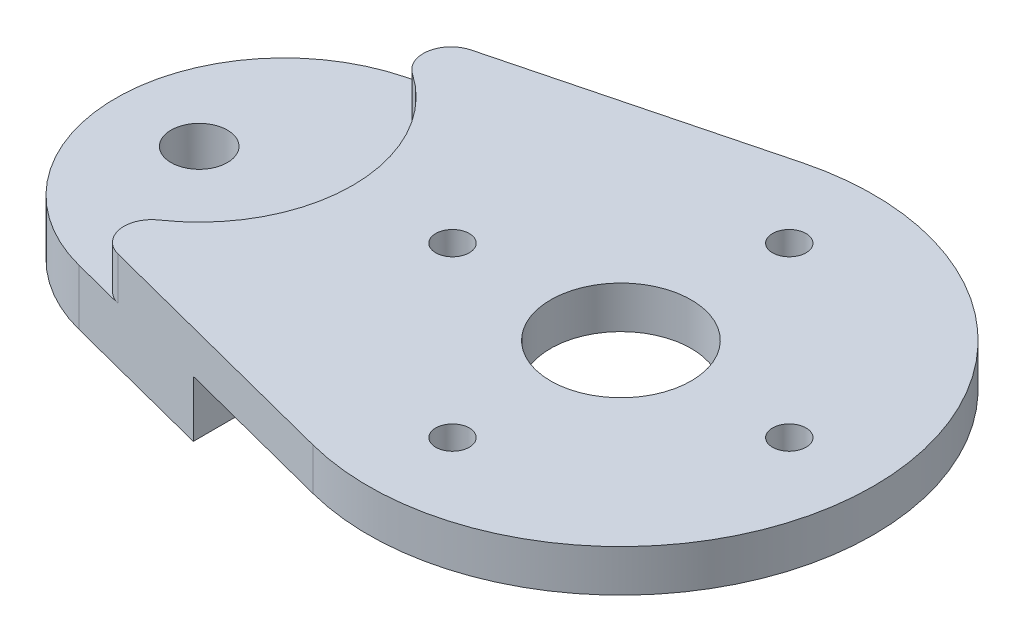
ISO-10303-21;
HEADER;
FILE_DESCRIPTION(('STEP AP214'),'2;1');
FILE_NAME('part.step','',(''),(''),'','','');
FILE_SCHEMA(('AUTOMOTIVE_DESIGN { 1 0 10303 214 1 1 1 1 }'));
ENDSEC;
DATA;
#1=APPLICATION_CONTEXT('core data for automotive mechanical design processes');
#2=APPLICATION_PROTOCOL_DEFINITION('international standard','automotive_design',2000,#1);
#3=PRODUCT_CONTEXT('',#1,'mechanical');
#4=PRODUCT('Part','Part','',(#3));
#5=PRODUCT_RELATED_PRODUCT_CATEGORY('part','',(#4));
#6=PRODUCT_DEFINITION_FORMATION('','',#4);
#7=PRODUCT_DEFINITION_CONTEXT('part definition',#1,'design');
#8=PRODUCT_DEFINITION('design','',#6,#7);
#9=PRODUCT_DEFINITION_SHAPE('','',#8);
#10=(LENGTH_UNIT() NAMED_UNIT(*) SI_UNIT(.MILLI.,.METRE.));
#11=(NAMED_UNIT(*) PLANE_ANGLE_UNIT() SI_UNIT($,.RADIAN.));
#12=(NAMED_UNIT(*) SI_UNIT($,.STERADIAN.) SOLID_ANGLE_UNIT());
#13=UNCERTAINTY_MEASURE_WITH_UNIT(LENGTH_MEASURE(1.E-05),#10,'distance_accuracy_value','');
#14=(GEOMETRIC_REPRESENTATION_CONTEXT(3) GLOBAL_UNCERTAINTY_ASSIGNED_CONTEXT((#13)) GLOBAL_UNIT_ASSIGNED_CONTEXT((#10,
#11,#12)) REPRESENTATION_CONTEXT('',''));
#15=CARTESIAN_POINT('',(0.,0.,0.));
#16=DIRECTION('',(0.,0.,1.));
#17=DIRECTION('',(1.,0.,0.));
#18=AXIS2_PLACEMENT_3D('',#15,#16,#17);
#19=CARTESIAN_POINT('',(0.,0.,0.));
#20=DIRECTION('',(0.,1.,0.));
#21=DIRECTION('',(0.,0.,1.));
#22=AXIS2_PLACEMENT_3D('',#19,#20,#21);
#23=PLANE('',#22);
#24=CARTESIAN_POINT('',(-30.226,0.,0.));
#25=DIRECTION('',(0.,1.,0.));
#26=DIRECTION('',(0.,0.,1.));
#27=AXIS2_PLACEMENT_3D('',#24,#25,#26);
#28=CIRCLE('',#27,10.033);
#29=CARTESIAN_POINT('',(-30.226,0.,10.033));
#30=VERTEX_POINT('',#29);
#31=EDGE_CURVE('E334',#30,#30,#28,.T.);
#32=ORIENTED_EDGE('',*,*,#31,.T.);
#33=EDGE_LOOP('',(#32));
#34=FACE_BOUND('',#33,.T.);
#35=DIRECTION('',(0.,0.,-1.));
#36=VECTOR('',#35,1.);
#37=CARTESIAN_POINT('',(39.878,0.,-116.327463550728));
#38=LINE('',#37,#36);
#39=CARTESIAN_POINT('',(39.878,0.,72.2063523133526));
#40=VERTEX_POINT('',#39);
#41=CARTESIAN_POINT('',(39.878,0.,-72.2063523133527));
#42=VERTEX_POINT('',#41);
#43=EDGE_CURVE('E118',#40,#42,#38,.T.);
#44=ORIENTED_EDGE('',*,*,#43,.F.);
#45=DIRECTION('',(0.968245836551854,0.,0.25));
#46=VECTOR('',#45,1.);
#47=CARTESIAN_POINT('',(-14.986,0.,58.0405284262644));
#48=LINE('',#47,#46);
#49=CARTESIAN_POINT('',(-14.986,0.,58.0405284262644));
#50=VERTEX_POINT('',#49);
#51=EDGE_CURVE('E131',#50,#40,#48,.T.);
#52=ORIENTED_EDGE('',*,*,#51,.F.);
#53=CARTESIAN_POINT('',(0.,0.,0.));
#54=DIRECTION('',(0.,1.,0.));
#55=DIRECTION('',(0.,0.,1.));
#56=AXIS2_PLACEMENT_3D('',#53,#54,#55);
#57=CIRCLE('',#56,59.944);
#58=CARTESIAN_POINT('',(-14.986,0.,-58.0405284262644));
#59=VERTEX_POINT('',#58);
#60=EDGE_CURVE('E136',#59,#50,#57,.T.);
#61=ORIENTED_EDGE('',*,*,#60,.F.);
#62=DIRECTION('',(-0.968245836551854,0.,0.25));
#63=VECTOR('',#62,1.);
#64=CARTESIAN_POINT('',(-14.986,0.,-58.0405284262644));
#65=LINE('',#64,#63);
#66=EDGE_CURVE('E132',#42,#59,#65,.T.);
#67=ORIENTED_EDGE('',*,*,#66,.F.);
#68=EDGE_LOOP('',(#44,#52,#61,#67));
#69=FACE_BOUND('',#68,.T.);
#70=ADVANCED_FACE('F39',(#34,#69),#23,.F.);
#71=CARTESIAN_POINT('',(0.,35.052,0.));
#72=DIRECTION('',(0.,-1.,0.));
#73=DIRECTION('',(0.,0.,-1.));
#74=AXIS2_PLACEMENT_3D('',#71,#72,#73);
#75=CYLINDRICAL_SURFACE('',#74,59.944);
#76=DIRECTION('',(0.,-1.,0.));
#77=VECTOR('',#76,1.);
#78=CARTESIAN_POINT('',(-14.986,35.052,58.0405284262644));
#79=LINE('',#78,#77);
#80=CARTESIAN_POINT('',(-14.986,19.812,58.0405284262644));
#81=VERTEX_POINT('',#80);
#82=EDGE_CURVE('E140',#81,#50,#79,.T.);
#83=ORIENTED_EDGE('',*,*,#82,.F.);
#84=CARTESIAN_POINT('',(0.,19.812,0.));
#85=DIRECTION('',(0.,1.,0.));
#86=DIRECTION('',(0.,0.,1.));
#87=AXIS2_PLACEMENT_3D('',#84,#85,#86);
#88=CIRCLE('',#87,59.944);
#89=CARTESIAN_POINT('',(-14.986,19.812,-58.0405284262644));
#90=VERTEX_POINT('',#89);
#91=EDGE_CURVE('E62',#90,#81,#88,.T.);
#92=ORIENTED_EDGE('',*,*,#91,.F.);
#93=DIRECTION('',(0.,-1.,0.));
#94=VECTOR('',#93,1.);
#95=CARTESIAN_POINT('',(-14.986,35.052,-58.0405284262644));
#96=LINE('',#95,#94);
#97=EDGE_CURVE('E148',#90,#59,#96,.T.);
#98=ORIENTED_EDGE('',*,*,#97,.T.);
#99=ORIENTED_EDGE('',*,*,#60,.T.);
#100=EDGE_LOOP('',(#83,#92,#98,#99));
#101=FACE_BOUND('',#100,.T.);
#102=ADVANCED_FACE('F181',(#101),#75,.T.);
#103=CARTESIAN_POINT('',(-14.986,35.052,58.0405284262644));
#104=DIRECTION('',(0.25,0.,-0.968245836551854));
#105=DIRECTION('',(-0.968245836551854,0.,-0.25));
#106=AXIS2_PLACEMENT_3D('',#103,#104,#105);
#107=PLANE('',#106);
#108=ORIENTED_EDGE('',*,*,#51,.T.);
#109=DIRECTION('',(0.,1.,0.));
#110=VECTOR('',#109,1.);
#111=CARTESIAN_POINT('',(39.878,35.052,72.2063523133527));
#112=LINE('',#111,#110);
#113=CARTESIAN_POINT('',(39.878,20.066,72.2063523133526));
#114=VERTEX_POINT('',#113);
#115=EDGE_CURVE('E116',#40,#114,#112,.T.);
#116=ORIENTED_EDGE('',*,*,#115,.T.);
#117=DIRECTION('',(0.968245836551854,0.,0.25));
#118=VECTOR('',#117,1.);
#119=CARTESIAN_POINT('',(-14.986,20.066,58.0405284262644));
#120=LINE('',#119,#118);
#121=CARTESIAN_POINT('',(97.4089999999999,20.066,87.0607926393966));
#122=VERTEX_POINT('',#121);
#123=EDGE_CURVE('E318',#114,#122,#120,.T.);
#124=ORIENTED_EDGE('',*,*,#123,.T.);
#125=DIRECTION('',(0.,-1.,0.));
#126=VECTOR('',#125,1.);
#127=CARTESIAN_POINT('',(97.4089999999999,35.052,87.0607926393966));
#128=LINE('',#127,#126);
#129=CARTESIAN_POINT('',(97.4089999999999,35.052,87.0607926393966));
#130=VERTEX_POINT('',#129);
#131=EDGE_CURVE('E155',#130,#122,#128,.T.);
#132=ORIENTED_EDGE('',*,*,#131,.F.);
#133=DIRECTION('',(0.968245836551854,0.,0.25));
#134=VECTOR('',#133,1.);
#135=CARTESIAN_POINT('',(-14.986,35.052,58.0405284262644));
#136=LINE('',#135,#134);
#137=CARTESIAN_POINT('',(3.69078405660418,35.052,62.8628533337271));
#138=VERTEX_POINT('',#137);
#139=EDGE_CURVE('E137',#138,#130,#136,.T.);
#140=ORIENTED_EDGE('',*,*,#139,.F.);
#141=DIRECTION('',(0.,1.,0.));
#142=VECTOR('',#141,1.);
#143=CARTESIAN_POINT('',(3.69078405660418,35.052,62.8628533337271));
#144=LINE('',#143,#142);
#145=CARTESIAN_POINT('',(3.69078405660418,19.812,62.8628533337271));
#146=VERTEX_POINT('',#145);
#147=EDGE_CURVE('E215',#138,#146,#144,.F.);
#148=ORIENTED_EDGE('',*,*,#147,.T.);
#149=DIRECTION('',(-0.968245836551854,0.,-0.25));
#150=VECTOR('',#149,1.);
#151=CARTESIAN_POINT('',(-14.986,19.812,58.0405284262644));
#152=LINE('',#151,#150);
#153=EDGE_CURVE('E230',#146,#81,#152,.T.);
#154=ORIENTED_EDGE('',*,*,#153,.T.);
#155=ORIENTED_EDGE('',*,*,#82,.T.);
#156=EDGE_LOOP('',(#108,#116,#124,#132,#140,#148,#154,#155));
#157=FACE_BOUND('',#156,.T.);
#158=ADVANCED_FACE('F134',(#157),#107,.F.);
#159=CARTESIAN_POINT('',(119.888,35.052,0.));
#160=DIRECTION('',(0.,-1.,0.));
#161=DIRECTION('',(0.,0.,-1.));
#162=AXIS2_PLACEMENT_3D('',#159,#160,#161);
#163=CYLINDRICAL_SURFACE('',#162,89.9160000000001);
#164=ORIENTED_EDGE('',*,*,#131,.T.);
#165=CARTESIAN_POINT('',(119.888,20.066,0.));
#166=DIRECTION('',(0.,1.,0.));
#167=DIRECTION('',(0.,0.,1.));
#168=AXIS2_PLACEMENT_3D('',#165,#166,#167);
#169=CIRCLE('',#168,89.9160000000001);
#170=CARTESIAN_POINT('',(97.409,20.066,-87.0607926393966));
#171=VERTEX_POINT('',#170);
#172=EDGE_CURVE('E313',#122,#171,#169,.T.);
#173=ORIENTED_EDGE('',*,*,#172,.T.);
#174=DIRECTION('',(0.,-1.,0.));
#175=VECTOR('',#174,1.);
#176=CARTESIAN_POINT('',(97.409,35.052,-87.0607926393966));
#177=LINE('',#176,#175);
#178=CARTESIAN_POINT('',(97.409,35.052,-87.0607926393966));
#179=VERTEX_POINT('',#178);
#180=EDGE_CURVE('E146',#179,#171,#177,.T.);
#181=ORIENTED_EDGE('',*,*,#180,.F.);
#182=CARTESIAN_POINT('',(119.888,35.052,0.));
#183=DIRECTION('',(0.,1.,0.));
#184=DIRECTION('',(0.,0.,1.));
#185=AXIS2_PLACEMENT_3D('',#182,#183,#184);
#186=CIRCLE('',#185,89.9160000000001);
#187=EDGE_CURVE('E246',#130,#179,#186,.T.);
#188=ORIENTED_EDGE('',*,*,#187,.F.);
#189=EDGE_LOOP('',(#164,#173,#181,#188));
#190=FACE_BOUND('',#189,.T.);
#191=ADVANCED_FACE('F190',(#190),#163,.T.);
#192=CARTESIAN_POINT('',(-14.986,35.052,-58.0405284262644));
#193=DIRECTION('',(0.25,0.,0.968245836551854));
#194=DIRECTION('',(0.968245836551854,0.,-0.25));
#195=AXIS2_PLACEMENT_3D('',#192,#193,#194);
#196=PLANE('',#195);
#197=DIRECTION('',(-0.968245836551854,0.,0.25));
#198=VECTOR('',#197,1.);
#199=CARTESIAN_POINT('',(-14.986,20.066,-58.0405284262644));
#200=LINE('',#199,#198);
#201=CARTESIAN_POINT('',(39.878,20.066,-72.2063523133526));
#202=VERTEX_POINT('',#201);
#203=EDGE_CURVE('E310',#171,#202,#200,.T.);
#204=ORIENTED_EDGE('',*,*,#203,.T.);
#205=DIRECTION('',(0.,-1.,0.));
#206=VECTOR('',#205,1.);
#207=CARTESIAN_POINT('',(39.878,35.052,-72.2063523133527));
#208=LINE('',#207,#206);
#209=EDGE_CURVE('E122',#202,#42,#208,.T.);
#210=ORIENTED_EDGE('',*,*,#209,.T.);
#211=ORIENTED_EDGE('',*,*,#66,.T.);
#212=ORIENTED_EDGE('',*,*,#97,.F.);
#213=DIRECTION('',(0.968245836551854,0.,-0.25));
#214=VECTOR('',#213,1.);
#215=CARTESIAN_POINT('',(-14.986,19.812,-58.0405284262644));
#216=LINE('',#215,#214);
#217=CARTESIAN_POINT('',(3.69078405660417,19.812,-62.8628533337271));
#218=VERTEX_POINT('',#217);
#219=EDGE_CURVE('E222',#90,#218,#216,.T.);
#220=ORIENTED_EDGE('',*,*,#219,.T.);
#221=DIRECTION('',(0.,1.,0.));
#222=VECTOR('',#221,1.);
#223=CARTESIAN_POINT('',(3.69078405660416,35.052,-62.8628533337271));
#224=LINE('',#223,#222);
#225=CARTESIAN_POINT('',(3.69078405660416,35.052,-62.8628533337271));
#226=VERTEX_POINT('',#225);
#227=EDGE_CURVE('E217',#218,#226,#224,.T.);
#228=ORIENTED_EDGE('',*,*,#227,.T.);
#229=DIRECTION('',(-0.968245836551854,0.,0.25));
#230=VECTOR('',#229,1.);
#231=CARTESIAN_POINT('',(-14.986,35.052,-58.0405284262644));
#232=LINE('',#231,#230);
#233=EDGE_CURVE('E149',#179,#226,#232,.T.);
#234=ORIENTED_EDGE('',*,*,#233,.F.);
#235=ORIENTED_EDGE('',*,*,#180,.T.);
#236=EDGE_LOOP('',(#204,#210,#211,#212,#220,#228,#234,#235));
#237=FACE_BOUND('',#236,.T.);
#238=ADVANCED_FACE('F176',(#237),#196,.F.);
#239=CARTESIAN_POINT('',(0.,35.052,0.));
#240=DIRECTION('',(0.,1.,0.));
#241=DIRECTION('',(0.,0.,1.));
#242=AXIS2_PLACEMENT_3D('',#239,#240,#241);
#243=PLANE('',#242);
#244=CARTESIAN_POINT('',(119.888,35.052,59.944));
#245=DIRECTION('',(0.,1.,0.));
#246=DIRECTION('',(-1.,0.,0.));
#247=AXIS2_PLACEMENT_3D('',#244,#245,#246);
#248=CIRCLE('',#247,5.96900000000001);
#249=CARTESIAN_POINT('',(113.919,35.052,59.944));
#250=VERTEX_POINT('',#249);
#251=EDGE_CURVE('E321',#250,#250,#248,.T.);
#252=ORIENTED_EDGE('',*,*,#251,.F.);
#253=EDGE_LOOP('',(#252));
#254=FACE_BOUND('',#253,.T.);
#255=CARTESIAN_POINT('',(59.944,35.052,0.));
#256=DIRECTION('',(0.,1.,0.));
#257=DIRECTION('',(0.,0.,-1.));
#258=AXIS2_PLACEMENT_3D('',#255,#256,#257);
#259=CIRCLE('',#258,5.96900000000001);
#260=CARTESIAN_POINT('',(59.944,35.052,-5.96900000000001));
#261=VERTEX_POINT('',#260);
#262=EDGE_CURVE('E324',#261,#261,#259,.T.);
#263=ORIENTED_EDGE('',*,*,#262,.F.);
#264=EDGE_LOOP('',(#263));
#265=FACE_BOUND('',#264,.T.);
#266=CARTESIAN_POINT('',(119.888000000001,35.052,-59.944));
#267=DIRECTION('',(0.,1.,0.));
#268=DIRECTION('',(1.,0.,0.));
#269=AXIS2_PLACEMENT_3D('',#266,#267,#268);
#270=CIRCLE('',#269,5.96900000000001);
#271=CARTESIAN_POINT('',(125.857000000001,35.052,-59.9439999999999));
#272=VERTEX_POINT('',#271);
#273=EDGE_CURVE('E124',#272,#272,#270,.T.);
#274=ORIENTED_EDGE('',*,*,#273,.F.);
#275=EDGE_LOOP('',(#274));
#276=FACE_BOUND('',#275,.T.);
#277=CARTESIAN_POINT('',(179.832,35.052,0.));
#278=DIRECTION('',(0.,1.,0.));
#279=DIRECTION('',(0.,0.,1.));
#280=AXIS2_PLACEMENT_3D('',#277,#278,#279);
#281=CIRCLE('',#280,5.96900000000001);
#282=CARTESIAN_POINT('',(179.832,35.052,5.96900000000001));
#283=VERTEX_POINT('',#282);
#284=EDGE_CURVE('E322',#283,#283,#281,.T.);
#285=ORIENTED_EDGE('',*,*,#284,.F.);
#286=EDGE_LOOP('',(#285));
#287=FACE_BOUND('',#286,.T.);
#288=CARTESIAN_POINT('',(-30.226,35.052,0.));
#289=DIRECTION('',(0.,1.,0.));
#290=DIRECTION('',(0.,0.,-1.));
#291=AXIS2_PLACEMENT_3D('',#288,#289,#290);
#292=CIRCLE('',#291,54.61);
#293=CARTESIAN_POINT('',(0.579338866810639,35.052,45.0919416004785));
#294=VERTEX_POINT('',#293);
#295=CARTESIAN_POINT('',(0.579338866810619,35.052,-45.0919416004785));
#296=VERTEX_POINT('',#295);
#297=EDGE_CURVE('E240',#294,#296,#292,.T.);
#298=ORIENTED_EDGE('',*,*,#297,.F.);
#299=CARTESIAN_POINT('',(6.16728405660419,35.052,53.2714100768444));
#300=DIRECTION('',(0.,1.,0.));
#301=DIRECTION('',(0.,0.,1.));
#302=AXIS2_PLACEMENT_3D('',#299,#300,#301);
#303=CIRCLE('',#302,9.906);
#304=EDGE_CURVE('E228',#294,#138,#303,.T.);
#305=ORIENTED_EDGE('',*,*,#304,.T.);
#306=ORIENTED_EDGE('',*,*,#139,.T.);
#307=ORIENTED_EDGE('',*,*,#187,.T.);
#308=ORIENTED_EDGE('',*,*,#233,.T.);
#309=CARTESIAN_POINT('',(6.16728405660417,35.052,-53.2714100768444));
#310=DIRECTION('',(0.,1.,0.));
#311=DIRECTION('',(0.,0.,1.));
#312=AXIS2_PLACEMENT_3D('',#309,#310,#311);
#313=CIRCLE('',#312,9.906);
#314=EDGE_CURVE('E233',#226,#296,#313,.T.);
#315=ORIENTED_EDGE('',*,*,#314,.T.);
#316=EDGE_LOOP('',(#298,#305,#306,#307,#308,#315));
#317=FACE_BOUND('',#316,.T.);
#318=CARTESIAN_POINT('',(119.888,35.052012,0.));
#319=DIRECTION('',(0.,1.,0.));
#320=DIRECTION('',(0.,0.,1.));
#321=AXIS2_PLACEMENT_3D('',#318,#319,#320);
#322=CIRCLE('',#321,25.019);
#323=CARTESIAN_POINT('',(119.888,35.052012,25.019));
#324=VERTEX_POINT('',#323);
#325=EDGE_CURVE('E142',#324,#324,#322,.T.);
#326=ORIENTED_EDGE('',*,*,#325,.F.);
#327=EDGE_LOOP('',(#326));
#328=FACE_BOUND('',#327,.T.);
#329=ADVANCED_FACE('F170',(#254,#265,#276,#287,#317,#328),#243,.T.);
#330=CARTESIAN_POINT('',(-30.226,0.,0.));
#331=DIRECTION('',(0.,1.,0.));
#332=DIRECTION('',(0.,0.,1.));
#333=AXIS2_PLACEMENT_3D('',#330,#331,#332);
#334=CYLINDRICAL_SURFACE('',#333,10.033);
#335=CARTESIAN_POINT('',(-30.226,19.812,0.));
#336=DIRECTION('',(0.,-1.,0.));
#337=DIRECTION('',(0.,0.,-1.));
#338=AXIS2_PLACEMENT_3D('',#335,#336,#337);
#339=CIRCLE('',#338,10.033);
#340=CARTESIAN_POINT('',(-30.226,19.812,-10.033));
#341=VERTEX_POINT('',#340);
#342=EDGE_CURVE('E164',#341,#341,#339,.F.);
#343=ORIENTED_EDGE('',*,*,#342,.T.);
#344=EDGE_LOOP('',(#343));
#345=FACE_BOUND('',#344,.T.);
#346=ORIENTED_EDGE('',*,*,#31,.F.);
#347=EDGE_LOOP('',(#346));
#348=FACE_BOUND('',#347,.T.);
#349=ADVANCED_FACE('F180',(#345,#348),#334,.F.);
#350=CARTESIAN_POINT('',(119.888,0.,0.));
#351=DIRECTION('',(0.,1.,0.));
#352=DIRECTION('',(0.,0.,1.));
#353=AXIS2_PLACEMENT_3D('',#350,#351,#352);
#354=CYLINDRICAL_SURFACE('',#353,25.019);
#355=CARTESIAN_POINT('',(119.888,20.066,0.));
#356=DIRECTION('',(0.,1.,0.));
#357=DIRECTION('',(0.,0.,1.));
#358=AXIS2_PLACEMENT_3D('',#355,#356,#357);
#359=CIRCLE('',#358,25.019);
#360=CARTESIAN_POINT('',(119.888,20.066,25.019));
#361=VERTEX_POINT('',#360);
#362=EDGE_CURVE('E306',#361,#361,#359,.F.);
#363=ORIENTED_EDGE('',*,*,#362,.T.);
#364=EDGE_LOOP('',(#363));
#365=FACE_BOUND('',#364,.T.);
#366=ORIENTED_EDGE('',*,*,#325,.T.);
#367=EDGE_LOOP('',(#366));
#368=FACE_BOUND('',#367,.T.);
#369=ADVANCED_FACE('F260',(#365,#368),#354,.F.);
#370=CARTESIAN_POINT('',(-15.113,19.812,0.));
#371=DIRECTION('',(0.,-1.,0.));
#372=DIRECTION('',(0.,0.,-1.));
#373=AXIS2_PLACEMENT_3D('',#370,#371,#372);
#374=PLANE('',#373);
#375=ORIENTED_EDGE('',*,*,#91,.T.);
#376=ORIENTED_EDGE('',*,*,#153,.F.);
#377=CARTESIAN_POINT('',(6.16728405660419,19.812,53.2714100768444));
#378=DIRECTION('',(0.,-1.,0.));
#379=DIRECTION('',(0.,0.,-1.));
#380=AXIS2_PLACEMENT_3D('',#377,#378,#379);
#381=CIRCLE('',#380,9.906);
#382=CARTESIAN_POINT('',(0.579338866810639,19.812,45.0919416004785));
#383=VERTEX_POINT('',#382);
#384=EDGE_CURVE('E48',#146,#383,#381,.T.);
#385=ORIENTED_EDGE('',*,*,#384,.T.);
#386=CARTESIAN_POINT('',(-30.226,19.812,0.));
#387=DIRECTION('',(0.,1.,0.));
#388=DIRECTION('',(0.,0.,-1.));
#389=AXIS2_PLACEMENT_3D('',#386,#387,#388);
#390=CIRCLE('',#389,54.61);
#391=CARTESIAN_POINT('',(0.579338866810619,19.812,-45.0919416004785));
#392=VERTEX_POINT('',#391);
#393=EDGE_CURVE('E232',#383,#392,#390,.T.);
#394=ORIENTED_EDGE('',*,*,#393,.T.);
#395=CARTESIAN_POINT('',(6.16728405660417,19.812,-53.2714100768444));
#396=DIRECTION('',(0.,-1.,0.));
#397=DIRECTION('',(0.,0.,-1.));
#398=AXIS2_PLACEMENT_3D('',#395,#396,#397);
#399=CIRCLE('',#398,9.906);
#400=EDGE_CURVE('E11',#392,#218,#399,.T.);
#401=ORIENTED_EDGE('',*,*,#400,.T.);
#402=ORIENTED_EDGE('',*,*,#219,.F.);
#403=EDGE_LOOP('',(#375,#376,#385,#394,#401,#402));
#404=FACE_BOUND('',#403,.T.);
#405=ORIENTED_EDGE('',*,*,#342,.F.);
#406=EDGE_LOOP('',(#405));
#407=FACE_BOUND('',#406,.T.);
#408=ADVANCED_FACE('F202',(#404,#407),#374,.F.);
#409=CARTESIAN_POINT('',(-30.226,19.812,0.));
#410=DIRECTION('',(0.,1.,0.));
#411=DIRECTION('',(0.,0.,1.));
#412=AXIS2_PLACEMENT_3D('',#409,#410,#411);
#413=CYLINDRICAL_SURFACE('',#412,54.61);
#414=ORIENTED_EDGE('',*,*,#393,.F.);
#415=DIRECTION('',(0.,1.,0.));
#416=VECTOR('',#415,1.);
#417=CARTESIAN_POINT('',(0.579338866810636,19.812,45.0919416004785));
#418=LINE('',#417,#416);
#419=EDGE_CURVE('E212',#383,#294,#418,.T.);
#420=ORIENTED_EDGE('',*,*,#419,.T.);
#421=ORIENTED_EDGE('',*,*,#297,.T.);
#422=DIRECTION('',(0.,1.,0.));
#423=VECTOR('',#422,1.);
#424=CARTESIAN_POINT('',(0.579338866810615,19.812,-45.0919416004785));
#425=LINE('',#424,#423);
#426=EDGE_CURVE('E156',#296,#392,#425,.F.);
#427=ORIENTED_EDGE('',*,*,#426,.T.);
#428=EDGE_LOOP('',(#414,#420,#421,#427));
#429=FACE_BOUND('',#428,.T.);
#430=ADVANCED_FACE('F197',(#429),#413,.F.);
#431=CARTESIAN_POINT('',(6.16728405660419,19.812,53.2714100768444));
#432=DIRECTION('',(0.,1.,0.));
#433=DIRECTION('',(0.,0.,1.));
#434=AXIS2_PLACEMENT_3D('',#431,#432,#433);
#435=CYLINDRICAL_SURFACE('',#434,9.906);
#436=ORIENTED_EDGE('',*,*,#384,.F.);
#437=ORIENTED_EDGE('',*,*,#147,.F.);
#438=ORIENTED_EDGE('',*,*,#304,.F.);
#439=ORIENTED_EDGE('',*,*,#419,.F.);
#440=EDGE_LOOP('',(#436,#437,#438,#439));
#441=FACE_BOUND('',#440,.T.);
#442=ADVANCED_FACE('F192',(#441),#435,.T.);
#443=CARTESIAN_POINT('',(6.16728405660417,19.812,-53.2714100768444));
#444=DIRECTION('',(0.,1.,0.));
#445=DIRECTION('',(0.,0.,1.));
#446=AXIS2_PLACEMENT_3D('',#443,#444,#445);
#447=CYLINDRICAL_SURFACE('',#446,9.906);
#448=ORIENTED_EDGE('',*,*,#400,.F.);
#449=ORIENTED_EDGE('',*,*,#426,.F.);
#450=ORIENTED_EDGE('',*,*,#314,.F.);
#451=ORIENTED_EDGE('',*,*,#227,.F.);
#452=EDGE_LOOP('',(#448,#449,#450,#451));
#453=FACE_BOUND('',#452,.T.);
#454=ADVANCED_FACE('F41',(#453),#447,.T.);
#455=CARTESIAN_POINT('',(179.832,0.,0.));
#456=DIRECTION('',(0.,1.,0.));
#457=DIRECTION('',(0.,0.,1.));
#458=AXIS2_PLACEMENT_3D('',#455,#456,#457);
#459=CYLINDRICAL_SURFACE('',#458,5.96900000000001);
#460=CARTESIAN_POINT('',(179.832,20.066,0.));
#461=DIRECTION('',(0.,1.,0.));
#462=DIRECTION('',(0.,0.,1.));
#463=AXIS2_PLACEMENT_3D('',#460,#461,#462);
#464=CIRCLE('',#463,5.96900000000001);
#465=CARTESIAN_POINT('',(179.832,20.066,5.96900000000001));
#466=VERTEX_POINT('',#465);
#467=EDGE_CURVE('E294',#466,#466,#464,.F.);
#468=ORIENTED_EDGE('',*,*,#467,.T.);
#469=EDGE_LOOP('',(#468));
#470=FACE_BOUND('',#469,.T.);
#471=ORIENTED_EDGE('',*,*,#284,.T.);
#472=EDGE_LOOP('',(#471));
#473=FACE_BOUND('',#472,.T.);
#474=ADVANCED_FACE('F201',(#470,#473),#459,.F.);
#475=CARTESIAN_POINT('',(119.888000000001,0.,-59.944));
#476=DIRECTION('',(0.,1.,0.));
#477=DIRECTION('',(0.,0.,1.));
#478=AXIS2_PLACEMENT_3D('',#475,#476,#477);
#479=CYLINDRICAL_SURFACE('',#478,5.96900000000001);
#480=CARTESIAN_POINT('',(119.888000000001,20.066,-59.944));
#481=DIRECTION('',(0.,1.,0.));
#482=DIRECTION('',(0.,0.,1.));
#483=AXIS2_PLACEMENT_3D('',#480,#481,#482);
#484=CIRCLE('',#483,5.96900000000001);
#485=CARTESIAN_POINT('',(119.888000000001,20.066,-53.975));
#486=VERTEX_POINT('',#485);
#487=EDGE_CURVE('E302',#486,#486,#484,.F.);
#488=ORIENTED_EDGE('',*,*,#487,.T.);
#489=EDGE_LOOP('',(#488));
#490=FACE_BOUND('',#489,.T.);
#491=ORIENTED_EDGE('',*,*,#273,.T.);
#492=EDGE_LOOP('',(#491));
#493=FACE_BOUND('',#492,.T.);
#494=ADVANCED_FACE('F271',(#490,#493),#479,.F.);
#495=CARTESIAN_POINT('',(59.944,0.,0.));
#496=DIRECTION('',(0.,1.,0.));
#497=DIRECTION('',(0.,0.,1.));
#498=AXIS2_PLACEMENT_3D('',#495,#496,#497);
#499=CYLINDRICAL_SURFACE('',#498,5.96900000000001);
#500=CARTESIAN_POINT('',(59.944,20.066,0.));
#501=DIRECTION('',(0.,1.,0.));
#502=DIRECTION('',(0.,0.,1.));
#503=AXIS2_PLACEMENT_3D('',#500,#501,#502);
#504=CIRCLE('',#503,5.96900000000001);
#505=CARTESIAN_POINT('',(59.944,20.066,5.96900000000001));
#506=VERTEX_POINT('',#505);
#507=EDGE_CURVE('E297',#506,#506,#504,.F.);
#508=ORIENTED_EDGE('',*,*,#507,.T.);
#509=EDGE_LOOP('',(#508));
#510=FACE_BOUND('',#509,.T.);
#511=ORIENTED_EDGE('',*,*,#262,.T.);
#512=EDGE_LOOP('',(#511));
#513=FACE_BOUND('',#512,.T.);
#514=ADVANCED_FACE('F274',(#510,#513),#499,.F.);
#515=CARTESIAN_POINT('',(119.888,0.,59.944));
#516=DIRECTION('',(0.,1.,0.));
#517=DIRECTION('',(0.,0.,1.));
#518=AXIS2_PLACEMENT_3D('',#515,#516,#517);
#519=CYLINDRICAL_SURFACE('',#518,5.96900000000001);
#520=CARTESIAN_POINT('',(119.888,20.066,59.944));
#521=DIRECTION('',(0.,1.,0.));
#522=DIRECTION('',(0.,0.,1.));
#523=AXIS2_PLACEMENT_3D('',#520,#521,#522);
#524=CIRCLE('',#523,5.96900000000001);
#525=CARTESIAN_POINT('',(119.888,20.066,65.913));
#526=VERTEX_POINT('',#525);
#527=EDGE_CURVE('E43',#526,#526,#524,.F.);
#528=ORIENTED_EDGE('',*,*,#527,.T.);
#529=EDGE_LOOP('',(#528));
#530=FACE_BOUND('',#529,.T.);
#531=ORIENTED_EDGE('',*,*,#251,.T.);
#532=EDGE_LOOP('',(#531));
#533=FACE_BOUND('',#532,.T.);
#534=ADVANCED_FACE('F276',(#530,#533),#519,.F.);
#535=CARTESIAN_POINT('',(39.878,20.066,-116.327463550728));
#536=DIRECTION('',(-1.,0.,0.));
#537=DIRECTION('',(0.,0.,1.));
#538=AXIS2_PLACEMENT_3D('',#535,#536,#537);
#539=PLANE('',#538);
#540=ORIENTED_EDGE('',*,*,#43,.T.);
#541=ORIENTED_EDGE('',*,*,#209,.F.);
#542=DIRECTION('',(0.,0.,-1.));
#543=VECTOR('',#542,1.);
#544=CARTESIAN_POINT('',(39.878,20.066,-116.327463550728));
#545=LINE('',#544,#543);
#546=EDGE_CURVE('E54',#114,#202,#545,.T.);
#547=ORIENTED_EDGE('',*,*,#546,.F.);
#548=ORIENTED_EDGE('',*,*,#115,.F.);
#549=EDGE_LOOP('',(#540,#541,#547,#548));
#550=FACE_BOUND('',#549,.T.);
#551=ADVANCED_FACE('F117',(#550),#539,.F.);
#552=CARTESIAN_POINT('',(0.,20.066,0.));
#553=DIRECTION('',(0.,1.,0.));
#554=DIRECTION('',(0.,0.,1.));
#555=AXIS2_PLACEMENT_3D('',#552,#553,#554);
#556=PLANE('',#555);
#557=ORIENTED_EDGE('',*,*,#467,.F.);
#558=EDGE_LOOP('',(#557));
#559=FACE_BOUND('',#558,.T.);
#560=ORIENTED_EDGE('',*,*,#507,.F.);
#561=EDGE_LOOP('',(#560));
#562=FACE_BOUND('',#561,.T.);
#563=ORIENTED_EDGE('',*,*,#527,.F.);
#564=EDGE_LOOP('',(#563));
#565=FACE_BOUND('',#564,.T.);
#566=ORIENTED_EDGE('',*,*,#487,.F.);
#567=EDGE_LOOP('',(#566));
#568=FACE_BOUND('',#567,.T.);
#569=ORIENTED_EDGE('',*,*,#362,.F.);
#570=EDGE_LOOP('',(#569));
#571=FACE_BOUND('',#570,.T.);
#572=ORIENTED_EDGE('',*,*,#546,.T.);
#573=ORIENTED_EDGE('',*,*,#203,.F.);
#574=ORIENTED_EDGE('',*,*,#172,.F.);
#575=ORIENTED_EDGE('',*,*,#123,.F.);
#576=EDGE_LOOP('',(#572,#573,#574,#575));
#577=FACE_BOUND('',#576,.T.);
#578=ADVANCED_FACE('F288',(#559,#562,#565,#568,#571,#577),#556,.F.);
#579=CLOSED_SHELL('',(#70,#102,#158,#191,#238,#329,#349,#369,#408,#430,#442,#454,#474,#494,#514,
#534,#551,#578));
#580=MANIFOLD_SOLID_BREP('B2',#579);
#581=ADVANCED_BREP_SHAPE_REPRESENTATION('',(#18,#580),#14);
#582=SHAPE_DEFINITION_REPRESENTATION(#9,#581);
ENDSEC;
END-ISO-10303-21;
